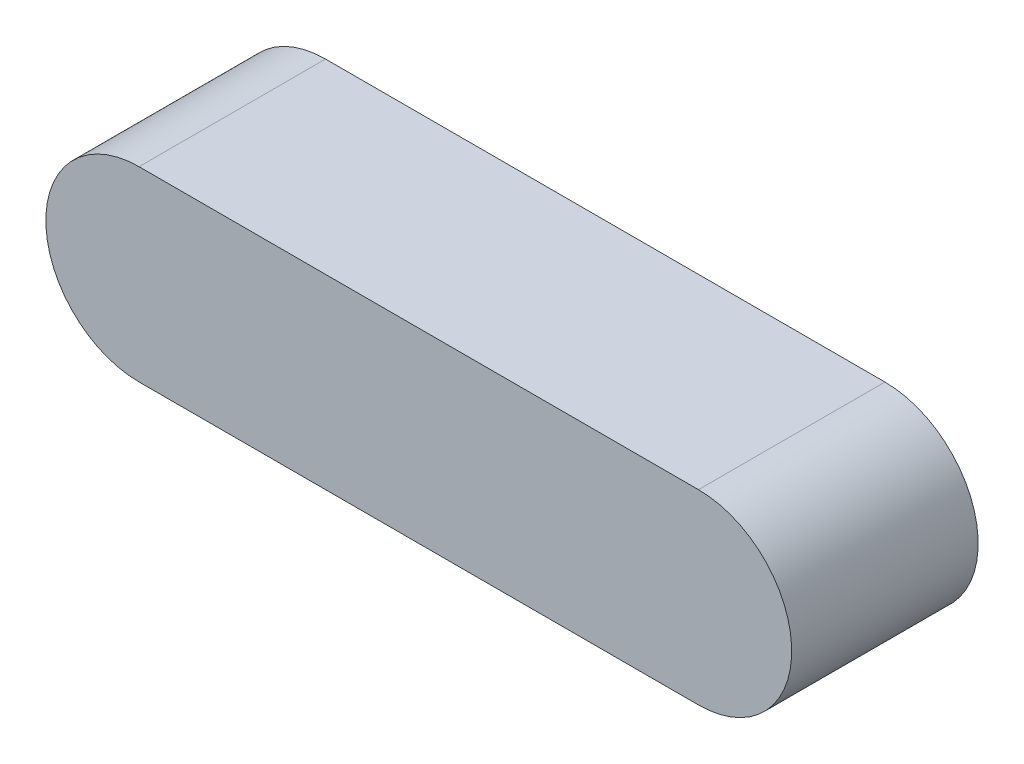
ISO-10303-21;
HEADER;
FILE_DESCRIPTION(('STEP AP214'),'2;1');
FILE_NAME('part.step','',(''),(''),'','','');
FILE_SCHEMA(('AUTOMOTIVE_DESIGN { 1 0 10303 214 1 1 1 1 }'));
ENDSEC;
DATA;
#1=APPLICATION_CONTEXT('core data for automotive mechanical design processes');
#2=APPLICATION_PROTOCOL_DEFINITION('international standard','automotive_design',2000,#1);
#3=PRODUCT_CONTEXT('',#1,'mechanical');
#4=PRODUCT('Part','Part','',(#3));
#5=PRODUCT_RELATED_PRODUCT_CATEGORY('part','',(#4));
#6=PRODUCT_DEFINITION_FORMATION('','',#4);
#7=PRODUCT_DEFINITION_CONTEXT('part definition',#1,'design');
#8=PRODUCT_DEFINITION('design','',#6,#7);
#9=PRODUCT_DEFINITION_SHAPE('','',#8);
#10=(LENGTH_UNIT() NAMED_UNIT(*) SI_UNIT(.MILLI.,.METRE.));
#11=(NAMED_UNIT(*) PLANE_ANGLE_UNIT() SI_UNIT($,.RADIAN.));
#12=(NAMED_UNIT(*) SI_UNIT($,.STERADIAN.) SOLID_ANGLE_UNIT());
#13=UNCERTAINTY_MEASURE_WITH_UNIT(LENGTH_MEASURE(1.E-05),#10,'distance_accuracy_value','');
#14=(GEOMETRIC_REPRESENTATION_CONTEXT(3) GLOBAL_UNCERTAINTY_ASSIGNED_CONTEXT((#13)) GLOBAL_UNIT_ASSIGNED_CONTEXT((#10,
#11,#12)) REPRESENTATION_CONTEXT('',''));
#15=CARTESIAN_POINT('',(0.,0.,0.));
#16=DIRECTION('',(0.,0.,1.));
#17=DIRECTION('',(1.,0.,0.));
#18=AXIS2_PLACEMENT_3D('',#15,#16,#17);
#19=CARTESIAN_POINT('',(0.,0.,4.));
#20=DIRECTION('',(0.,0.,1.));
#21=DIRECTION('',(1.,0.,0.));
#22=AXIS2_PLACEMENT_3D('',#19,#20,#21);
#23=PLANE('',#22);
#24=CARTESIAN_POINT('',(12.,-2.,4.));
#25=DIRECTION('',(0.,0.,1.));
#26=DIRECTION('',(1.,0.,0.));
#27=AXIS2_PLACEMENT_3D('',#24,#25,#26);
#28=CIRCLE('',#27,2.);
#29=CARTESIAN_POINT('',(12.,0.,4.));
#30=VERTEX_POINT('',#29);
#31=CARTESIAN_POINT('',(12.,-4.,4.));
#32=VERTEX_POINT('',#31);
#33=EDGE_CURVE('E59',#30,#32,#28,.F.);
#34=ORIENTED_EDGE('',*,*,#33,.F.);
#35=DIRECTION('',(1.,0.,0.));
#36=VECTOR('',#35,1.);
#37=CARTESIAN_POINT('',(12.,0.,4.));
#38=LINE('',#37,#36);
#39=CARTESIAN_POINT('',(0.,0.,4.));
#40=VERTEX_POINT('',#39);
#41=EDGE_CURVE('E56',#40,#30,#38,.T.);
#42=ORIENTED_EDGE('',*,*,#41,.F.);
#43=CARTESIAN_POINT('',(0.,-2.,4.));
#44=DIRECTION('',(0.,0.,1.));
#45=DIRECTION('',(1.,0.,0.));
#46=AXIS2_PLACEMENT_3D('',#43,#44,#45);
#47=CIRCLE('',#46,2.);
#48=CARTESIAN_POINT('',(0.,-4.,4.));
#49=VERTEX_POINT('',#48);
#50=EDGE_CURVE('E20',#49,#40,#47,.F.);
#51=ORIENTED_EDGE('',*,*,#50,.F.);
#52=DIRECTION('',(1.,0.,0.));
#53=VECTOR('',#52,1.);
#54=CARTESIAN_POINT('',(0.,-4.,4.));
#55=LINE('',#54,#53);
#56=EDGE_CURVE('E61',#32,#49,#55,.F.);
#57=ORIENTED_EDGE('',*,*,#56,.F.);
#58=EDGE_LOOP('',(#34,#42,#51,#57));
#59=FACE_BOUND('',#58,.T.);
#60=ADVANCED_FACE('F17',(#59),#23,.T.);
#61=CARTESIAN_POINT('',(12.,0.,0.));
#62=DIRECTION('',(0.,1.,0.));
#63=DIRECTION('',(0.,0.,1.));
#64=AXIS2_PLACEMENT_3D('',#61,#62,#63);
#65=PLANE('',#64);
#66=DIRECTION('',(0.,0.,1.));
#67=VECTOR('',#66,1.);
#68=CARTESIAN_POINT('',(0.,0.,0.));
#69=LINE('',#68,#67);
#70=CARTESIAN_POINT('',(0.,0.,0.));
#71=VERTEX_POINT('',#70);
#72=EDGE_CURVE('E71',#40,#71,#69,.F.);
#73=ORIENTED_EDGE('',*,*,#72,.F.);
#74=ORIENTED_EDGE('',*,*,#41,.T.);
#75=DIRECTION('',(0.,0.,1.));
#76=VECTOR('',#75,1.);
#77=CARTESIAN_POINT('',(12.,0.,0.));
#78=LINE('',#77,#76);
#79=CARTESIAN_POINT('',(12.,0.,0.));
#80=VERTEX_POINT('',#79);
#81=EDGE_CURVE('E70',#30,#80,#78,.F.);
#82=ORIENTED_EDGE('',*,*,#81,.T.);
#83=DIRECTION('',(1.,0.,0.));
#84=VECTOR('',#83,1.);
#85=CARTESIAN_POINT('',(0.,0.,0.));
#86=LINE('',#85,#84);
#87=EDGE_CURVE('E82',#80,#71,#86,.F.);
#88=ORIENTED_EDGE('',*,*,#87,.T.);
#89=EDGE_LOOP('',(#73,#74,#82,#88));
#90=FACE_BOUND('',#89,.T.);
#91=ADVANCED_FACE('F68',(#90),#65,.T.);
#92=CARTESIAN_POINT('',(0.,-2.,0.));
#93=DIRECTION('',(0.,0.,1.));
#94=DIRECTION('',(1.,0.,0.));
#95=AXIS2_PLACEMENT_3D('',#92,#93,#94);
#96=CYLINDRICAL_SURFACE('',#95,2.);
#97=DIRECTION('',(0.,0.,-1.));
#98=VECTOR('',#97,1.);
#99=CARTESIAN_POINT('',(0.,-4.,0.));
#100=LINE('',#99,#98);
#101=CARTESIAN_POINT('',(0.,-4.,0.));
#102=VERTEX_POINT('',#101);
#103=EDGE_CURVE('E78',#49,#102,#100,.T.);
#104=ORIENTED_EDGE('',*,*,#103,.F.);
#105=ORIENTED_EDGE('',*,*,#50,.T.);
#106=ORIENTED_EDGE('',*,*,#72,.T.);
#107=CARTESIAN_POINT('',(0.,-2.,0.));
#108=DIRECTION('',(0.,0.,1.));
#109=DIRECTION('',(1.,0.,0.));
#110=AXIS2_PLACEMENT_3D('',#107,#108,#109);
#111=CIRCLE('',#110,2.);
#112=EDGE_CURVE('E26',#71,#102,#111,.T.);
#113=ORIENTED_EDGE('',*,*,#112,.T.);
#114=EDGE_LOOP('',(#104,#105,#106,#113));
#115=FACE_BOUND('',#114,.T.);
#116=ADVANCED_FACE('F89',(#115),#96,.T.);
#117=CARTESIAN_POINT('',(0.,-4.,0.));
#118=DIRECTION('',(0.,-1.,0.));
#119=DIRECTION('',(0.,0.,-1.));
#120=AXIS2_PLACEMENT_3D('',#117,#118,#119);
#121=PLANE('',#120);
#122=DIRECTION('',(0.,0.,1.));
#123=VECTOR('',#122,1.);
#124=CARTESIAN_POINT('',(12.,-4.,0.));
#125=LINE('',#124,#123);
#126=CARTESIAN_POINT('',(12.,-4.,0.));
#127=VERTEX_POINT('',#126);
#128=EDGE_CURVE('E65',#32,#127,#125,.F.);
#129=ORIENTED_EDGE('',*,*,#128,.F.);
#130=ORIENTED_EDGE('',*,*,#56,.T.);
#131=ORIENTED_EDGE('',*,*,#103,.T.);
#132=DIRECTION('',(1.,0.,0.));
#133=VECTOR('',#132,1.);
#134=CARTESIAN_POINT('',(0.,-4.,0.));
#135=LINE('',#134,#133);
#136=EDGE_CURVE('E11',#102,#127,#135,.T.);
#137=ORIENTED_EDGE('',*,*,#136,.T.);
#138=EDGE_LOOP('',(#129,#130,#131,#137));
#139=FACE_BOUND('',#138,.T.);
#140=ADVANCED_FACE('F91',(#139),#121,.T.);
#141=CARTESIAN_POINT('',(12.,-2.,0.));
#142=DIRECTION('',(0.,0.,1.));
#143=DIRECTION('',(1.,0.,0.));
#144=AXIS2_PLACEMENT_3D('',#141,#142,#143);
#145=CYLINDRICAL_SURFACE('',#144,2.);
#146=ORIENTED_EDGE('',*,*,#33,.T.);
#147=ORIENTED_EDGE('',*,*,#128,.T.);
#148=CARTESIAN_POINT('',(12.,-2.,0.));
#149=DIRECTION('',(0.,0.,1.));
#150=DIRECTION('',(1.,0.,0.));
#151=AXIS2_PLACEMENT_3D('',#148,#149,#150);
#152=CIRCLE('',#151,2.);
#153=EDGE_CURVE('E35',#127,#80,#152,.T.);
#154=ORIENTED_EDGE('',*,*,#153,.T.);
#155=ORIENTED_EDGE('',*,*,#81,.F.);
#156=EDGE_LOOP('',(#146,#147,#154,#155));
#157=FACE_BOUND('',#156,.T.);
#158=ADVANCED_FACE('F73',(#157),#145,.T.);
#159=CARTESIAN_POINT('',(0.,0.,0.));
#160=DIRECTION('',(0.,0.,1.));
#161=DIRECTION('',(1.,0.,0.));
#162=AXIS2_PLACEMENT_3D('',#159,#160,#161);
#163=PLANE('',#162);
#164=ORIENTED_EDGE('',*,*,#136,.F.);
#165=ORIENTED_EDGE('',*,*,#112,.F.);
#166=ORIENTED_EDGE('',*,*,#87,.F.);
#167=ORIENTED_EDGE('',*,*,#153,.F.);
#168=EDGE_LOOP('',(#164,#165,#166,#167));
#169=FACE_BOUND('',#168,.T.);
#170=ADVANCED_FACE('F90',(#169),#163,.F.);
#171=CLOSED_SHELL('',(#60,#91,#116,#140,#158,#170));
#172=MANIFOLD_SOLID_BREP('B1',#171);
#173=ADVANCED_BREP_SHAPE_REPRESENTATION('',(#18,#172),#14);
#174=SHAPE_DEFINITION_REPRESENTATION(#9,#173);
ENDSEC;
END-ISO-10303-21;
